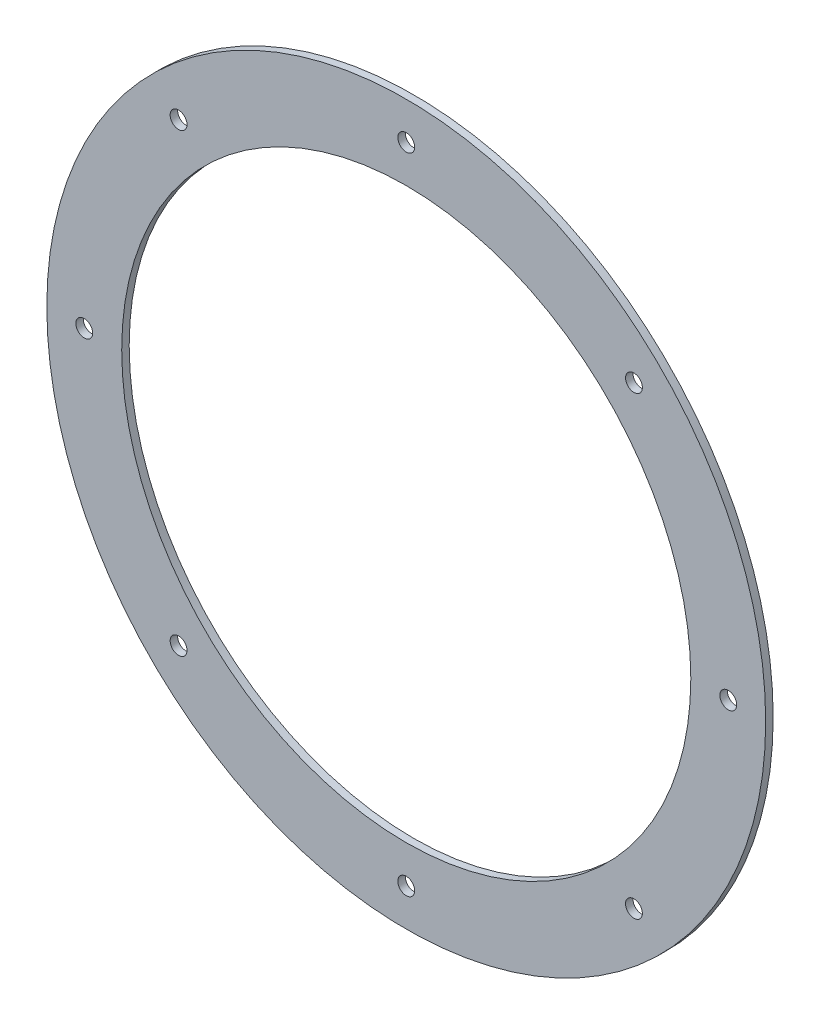
ISO-10303-21;
HEADER;
FILE_DESCRIPTION(('STEP AP214'),'2;1');
FILE_NAME('part.step','',(''),(''),'','','');
FILE_SCHEMA(('AUTOMOTIVE_DESIGN { 1 0 10303 214 1 1 1 1 }'));
ENDSEC;
DATA;
#1=APPLICATION_CONTEXT('core data for automotive mechanical design processes');
#2=APPLICATION_PROTOCOL_DEFINITION('international standard','automotive_design',2000,#1);
#3=PRODUCT_CONTEXT('',#1,'mechanical');
#4=PRODUCT('Part','Part','',(#3));
#5=PRODUCT_RELATED_PRODUCT_CATEGORY('part','',(#4));
#6=PRODUCT_DEFINITION_FORMATION('','',#4);
#7=PRODUCT_DEFINITION_CONTEXT('part definition',#1,'design');
#8=PRODUCT_DEFINITION('design','',#6,#7);
#9=PRODUCT_DEFINITION_SHAPE('','',#8);
#10=(LENGTH_UNIT() NAMED_UNIT(*) SI_UNIT(.MILLI.,.METRE.));
#11=(NAMED_UNIT(*) PLANE_ANGLE_UNIT() SI_UNIT($,.RADIAN.));
#12=(NAMED_UNIT(*) SI_UNIT($,.STERADIAN.) SOLID_ANGLE_UNIT());
#13=UNCERTAINTY_MEASURE_WITH_UNIT(LENGTH_MEASURE(1.E-05),#10,'distance_accuracy_value','');
#14=(GEOMETRIC_REPRESENTATION_CONTEXT(3) GLOBAL_UNCERTAINTY_ASSIGNED_CONTEXT((#13)) GLOBAL_UNIT_ASSIGNED_CONTEXT((#10,
#11,#12)) REPRESENTATION_CONTEXT('',''));
#15=CARTESIAN_POINT('',(0.,0.,0.));
#16=DIRECTION('',(0.,0.,1.));
#17=DIRECTION('',(1.,0.,0.));
#18=AXIS2_PLACEMENT_3D('',#15,#16,#17);
#19=CARTESIAN_POINT('',(0.,0.,-4.));
#20=DIRECTION('',(0.,0.,1.));
#21=DIRECTION('',(1.,0.,0.));
#22=AXIS2_PLACEMENT_3D('',#19,#20,#21);
#23=CYLINDRICAL_SURFACE('',#22,192.);
#24=CARTESIAN_POINT('',(0.,0.,-4.));
#25=DIRECTION('',(0.,0.,1.));
#26=DIRECTION('',(1.,0.,0.));
#27=AXIS2_PLACEMENT_3D('',#24,#25,#26);
#28=CIRCLE('',#27,192.);
#29=CARTESIAN_POINT('',(192.,0.,-4.));
#30=VERTEX_POINT('',#29);
#31=EDGE_CURVE('E10',#30,#30,#28,.T.);
#32=ORIENTED_EDGE('',*,*,#31,.T.);
#33=EDGE_LOOP('',(#32));
#34=FACE_BOUND('',#33,.T.);
#35=CARTESIAN_POINT('',(0.,0.,0.));
#36=DIRECTION('',(0.,0.,1.));
#37=DIRECTION('',(1.,0.,0.));
#38=AXIS2_PLACEMENT_3D('',#35,#36,#37);
#39=CIRCLE('',#38,192.);
#40=CARTESIAN_POINT('',(192.,0.,0.));
#41=VERTEX_POINT('',#40);
#42=EDGE_CURVE('E36',#41,#41,#39,.T.);
#43=ORIENTED_EDGE('',*,*,#42,.F.);
#44=EDGE_LOOP('',(#43));
#45=FACE_BOUND('',#44,.T.);
#46=ADVANCED_FACE('F33',(#34,#45),#23,.T.);
#47=CARTESIAN_POINT('',(0.,0.,-4.));
#48=DIRECTION('',(0.,0.,1.));
#49=DIRECTION('',(1.,0.,0.));
#50=AXIS2_PLACEMENT_3D('',#47,#48,#49);
#51=PLANE('',#50);
#52=CARTESIAN_POINT('',(121.622366364085,121.622366364088,-4.));
#53=DIRECTION('',(0.,0.,1.));
#54=DIRECTION('',(1.,0.,0.));
#55=AXIS2_PLACEMENT_3D('',#52,#53,#54);
#56=CIRCLE('',#55,4.5);
#57=CARTESIAN_POINT('',(126.122366364085,121.622366364088,-4.));
#58=VERTEX_POINT('',#57);
#59=EDGE_CURVE('E92',#58,#58,#56,.T.);
#60=ORIENTED_EDGE('',*,*,#59,.T.);
#61=EDGE_LOOP('',(#60));
#62=FACE_BOUND('',#61,.T.);
#63=CARTESIAN_POINT('',(172.,1.80160541433244E-12,-4.));
#64=DIRECTION('',(0.,0.,1.));
#65=DIRECTION('',(1.,0.,0.));
#66=AXIS2_PLACEMENT_3D('',#63,#64,#65);
#67=CIRCLE('',#66,4.5);
#68=CARTESIAN_POINT('',(176.5,1.80160541433244E-12,-4.));
#69=VERTEX_POINT('',#68);
#70=EDGE_CURVE('E86',#69,#69,#67,.T.);
#71=ORIENTED_EDGE('',*,*,#70,.T.);
#72=EDGE_LOOP('',(#71));
#73=FACE_BOUND('',#72,.T.);
#74=CARTESIAN_POINT('',(121.622366364087,-121.622366364085,-4.));
#75=DIRECTION('',(0.,0.,1.));
#76=DIRECTION('',(1.,0.,0.));
#77=AXIS2_PLACEMENT_3D('',#74,#75,#76);
#78=CIRCLE('',#77,4.5);
#79=CARTESIAN_POINT('',(126.122366364087,-121.622366364085,-4.));
#80=VERTEX_POINT('',#79);
#81=EDGE_CURVE('E80',#80,#80,#78,.T.);
#82=ORIENTED_EDGE('',*,*,#81,.T.);
#83=EDGE_LOOP('',(#82));
#84=FACE_BOUND('',#83,.T.);
#85=CARTESIAN_POINT('',(0.,-172.,-4.));
#86=DIRECTION('',(0.,0.,1.));
#87=DIRECTION('',(1.,0.,0.));
#88=AXIS2_PLACEMENT_3D('',#85,#86,#87);
#89=CIRCLE('',#88,4.5);
#90=CARTESIAN_POINT('',(4.5,-172.,-4.));
#91=VERTEX_POINT('',#90);
#92=EDGE_CURVE('E74',#91,#91,#89,.T.);
#93=ORIENTED_EDGE('',*,*,#92,.T.);
#94=EDGE_LOOP('',(#93));
#95=FACE_BOUND('',#94,.T.);
#96=CARTESIAN_POINT('',(-121.622366364086,-121.622366364087,-4.));
#97=DIRECTION('',(0.,0.,1.));
#98=DIRECTION('',(1.,0.,0.));
#99=AXIS2_PLACEMENT_3D('',#96,#97,#98);
#100=CIRCLE('',#99,4.5);
#101=CARTESIAN_POINT('',(-117.122366364086,-121.622366364087,-4.));
#102=VERTEX_POINT('',#101);
#103=EDGE_CURVE('E68',#102,#102,#100,.T.);
#104=ORIENTED_EDGE('',*,*,#103,.T.);
#105=EDGE_LOOP('',(#104));
#106=FACE_BOUND('',#105,.T.);
#107=CARTESIAN_POINT('',(-172.,-6.00535138110814E-13,-4.));
#108=DIRECTION('',(0.,0.,1.));
#109=DIRECTION('',(1.,0.,0.));
#110=AXIS2_PLACEMENT_3D('',#107,#108,#109);
#111=CIRCLE('',#110,4.5);
#112=CARTESIAN_POINT('',(-167.5,-6.00535138110814E-13,-4.));
#113=VERTEX_POINT('',#112);
#114=EDGE_CURVE('E62',#113,#113,#111,.T.);
#115=ORIENTED_EDGE('',*,*,#114,.T.);
#116=EDGE_LOOP('',(#115));
#117=FACE_BOUND('',#116,.T.);
#118=CARTESIAN_POINT('',(-121.622366364086,121.622366364086,-4.));
#119=DIRECTION('',(0.,0.,1.));
#120=DIRECTION('',(1.,0.,0.));
#121=AXIS2_PLACEMENT_3D('',#118,#119,#120);
#122=CIRCLE('',#121,4.5);
#123=CARTESIAN_POINT('',(-117.122366364086,121.622366364086,-4.));
#124=VERTEX_POINT('',#123);
#125=EDGE_CURVE('E56',#124,#124,#122,.T.);
#126=ORIENTED_EDGE('',*,*,#125,.T.);
#127=EDGE_LOOP('',(#126));
#128=FACE_BOUND('',#127,.T.);
#129=CARTESIAN_POINT('',(0.,172.,-4.));
#130=DIRECTION('',(0.,0.,1.));
#131=DIRECTION('',(1.,0.,0.));
#132=AXIS2_PLACEMENT_3D('',#129,#130,#131);
#133=CIRCLE('',#132,4.5);
#134=CARTESIAN_POINT('',(4.5,172.,-4.));
#135=VERTEX_POINT('',#134);
#136=EDGE_CURVE('E48',#135,#135,#133,.T.);
#137=ORIENTED_EDGE('',*,*,#136,.T.);
#138=EDGE_LOOP('',(#137));
#139=FACE_BOUND('',#138,.T.);
#140=CARTESIAN_POINT('',(0.,0.,-4.));
#141=DIRECTION('',(0.,0.,1.));
#142=DIRECTION('',(1.,0.,0.));
#143=AXIS2_PLACEMENT_3D('',#140,#141,#142);
#144=CIRCLE('',#143,152.);
#145=CARTESIAN_POINT('',(152.,0.,-4.));
#146=VERTEX_POINT('',#145);
#147=EDGE_CURVE('E43',#146,#146,#144,.T.);
#148=ORIENTED_EDGE('',*,*,#147,.T.);
#149=EDGE_LOOP('',(#148));
#150=FACE_BOUND('',#149,.T.);
#151=ORIENTED_EDGE('',*,*,#31,.F.);
#152=EDGE_LOOP('',(#151));
#153=FACE_BOUND('',#152,.T.);
#154=ADVANCED_FACE('F106',(#62,#73,#84,#95,#106,#117,#128,#139,#150,#153),#51,.F.);
#155=CARTESIAN_POINT('',(0.,0.,0.));
#156=DIRECTION('',(0.,0.,1.));
#157=DIRECTION('',(1.,0.,0.));
#158=AXIS2_PLACEMENT_3D('',#155,#156,#157);
#159=PLANE('',#158);
#160=CARTESIAN_POINT('',(121.622366364085,121.622366364088,0.));
#161=DIRECTION('',(0.,0.,1.));
#162=DIRECTION('',(0.707106781186556,-0.707106781186539,0.));
#163=AXIS2_PLACEMENT_3D('',#160,#161,#162);
#164=CIRCLE('',#163,4.5);
#165=CARTESIAN_POINT('',(124.804346879424,118.440385848748,0.));
#166=VERTEX_POINT('',#165);
#167=EDGE_CURVE('E95',#166,#166,#164,.T.);
#168=ORIENTED_EDGE('',*,*,#167,.F.);
#169=EDGE_LOOP('',(#168));
#170=FACE_BOUND('',#169,.T.);
#171=CARTESIAN_POINT('',(172.,1.80160541433244E-12,0.));
#172=DIRECTION('',(0.,0.,1.));
#173=DIRECTION('',(0.,-1.,0.));
#174=AXIS2_PLACEMENT_3D('',#171,#172,#173);
#175=CIRCLE('',#174,4.5);
#176=CARTESIAN_POINT('',(172.,-4.4999999999982,0.));
#177=VERTEX_POINT('',#176);
#178=EDGE_CURVE('E89',#177,#177,#175,.T.);
#179=ORIENTED_EDGE('',*,*,#178,.F.);
#180=EDGE_LOOP('',(#179));
#181=FACE_BOUND('',#180,.T.);
#182=CARTESIAN_POINT('',(121.622366364087,-121.622366364085,0.));
#183=DIRECTION('',(0.,0.,1.));
#184=DIRECTION('',(-0.707106781186541,-0.707106781186554,0.));
#185=AXIS2_PLACEMENT_3D('',#182,#183,#184);
#186=CIRCLE('',#185,4.5);
#187=CARTESIAN_POINT('',(118.440385848748,-124.804346879425,0.));
#188=VERTEX_POINT('',#187);
#189=EDGE_CURVE('E83',#188,#188,#186,.T.);
#190=ORIENTED_EDGE('',*,*,#189,.F.);
#191=EDGE_LOOP('',(#190));
#192=FACE_BOUND('',#191,.T.);
#193=CARTESIAN_POINT('',(0.,-172.,0.));
#194=DIRECTION('',(0.,0.,1.));
#195=DIRECTION('',(-1.,0.,0.));
#196=AXIS2_PLACEMENT_3D('',#193,#194,#195);
#197=CIRCLE('',#196,4.5);
#198=CARTESIAN_POINT('',(-4.5,-172.,0.));
#199=VERTEX_POINT('',#198);
#200=EDGE_CURVE('E77',#199,#199,#197,.T.);
#201=ORIENTED_EDGE('',*,*,#200,.F.);
#202=EDGE_LOOP('',(#201));
#203=FACE_BOUND('',#202,.T.);
#204=CARTESIAN_POINT('',(-121.622366364086,-121.622366364087,0.));
#205=DIRECTION('',(0.,0.,1.));
#206=DIRECTION('',(-0.707106781186551,0.707106781186544,0.));
#207=AXIS2_PLACEMENT_3D('',#204,#205,#206);
#208=CIRCLE('',#207,4.5);
#209=CARTESIAN_POINT('',(-124.804346879425,-118.440385848747,0.));
#210=VERTEX_POINT('',#209);
#211=EDGE_CURVE('E71',#210,#210,#208,.T.);
#212=ORIENTED_EDGE('',*,*,#211,.F.);
#213=EDGE_LOOP('',(#212));
#214=FACE_BOUND('',#213,.T.);
#215=CARTESIAN_POINT('',(-172.,-6.00535138110814E-13,0.));
#216=DIRECTION('',(0.,0.,1.));
#217=DIRECTION('',(0.,1.,0.));
#218=AXIS2_PLACEMENT_3D('',#215,#216,#217);
#219=CIRCLE('',#218,4.5);
#220=CARTESIAN_POINT('',(-172.,4.4999999999994,0.));
#221=VERTEX_POINT('',#220);
#222=EDGE_CURVE('E65',#221,#221,#219,.T.);
#223=ORIENTED_EDGE('',*,*,#222,.F.);
#224=EDGE_LOOP('',(#223));
#225=FACE_BOUND('',#224,.T.);
#226=CARTESIAN_POINT('',(-121.622366364086,121.622366364086,0.));
#227=DIRECTION('',(0.,0.,1.));
#228=DIRECTION('',(0.707106781186546,0.707106781186549,0.));
#229=AXIS2_PLACEMENT_3D('',#226,#227,#228);
#230=CIRCLE('',#229,4.5);
#231=CARTESIAN_POINT('',(-118.440385848747,124.804346879425,0.));
#232=VERTEX_POINT('',#231);
#233=EDGE_CURVE('E59',#232,#232,#230,.T.);
#234=ORIENTED_EDGE('',*,*,#233,.F.);
#235=EDGE_LOOP('',(#234));
#236=FACE_BOUND('',#235,.T.);
#237=CARTESIAN_POINT('',(0.,172.,0.));
#238=DIRECTION('',(0.,0.,1.));
#239=DIRECTION('',(1.,0.,0.));
#240=AXIS2_PLACEMENT_3D('',#237,#238,#239);
#241=CIRCLE('',#240,4.5);
#242=CARTESIAN_POINT('',(4.5,172.,0.));
#243=VERTEX_POINT('',#242);
#244=EDGE_CURVE('E53',#243,#243,#241,.T.);
#245=ORIENTED_EDGE('',*,*,#244,.F.);
#246=EDGE_LOOP('',(#245));
#247=FACE_BOUND('',#246,.T.);
#248=CARTESIAN_POINT('',(0.,0.,0.));
#249=DIRECTION('',(0.,0.,1.));
#250=DIRECTION('',(1.,0.,0.));
#251=AXIS2_PLACEMENT_3D('',#248,#249,#250);
#252=CIRCLE('',#251,152.);
#253=CARTESIAN_POINT('',(152.,0.,0.));
#254=VERTEX_POINT('',#253);
#255=EDGE_CURVE('E45',#254,#254,#252,.T.);
#256=ORIENTED_EDGE('',*,*,#255,.F.);
#257=EDGE_LOOP('',(#256));
#258=FACE_BOUND('',#257,.T.);
#259=ORIENTED_EDGE('',*,*,#42,.T.);
#260=EDGE_LOOP('',(#259));
#261=FACE_BOUND('',#260,.T.);
#262=ADVANCED_FACE('F102',(#170,#181,#192,#203,#214,#225,#236,#247,#258,#261),#159,.T.);
#263=CARTESIAN_POINT('',(0.,0.,-4.));
#264=DIRECTION('',(0.,0.,1.));
#265=DIRECTION('',(1.,0.,0.));
#266=AXIS2_PLACEMENT_3D('',#263,#264,#265);
#267=CYLINDRICAL_SURFACE('',#266,152.);
#268=ORIENTED_EDGE('',*,*,#147,.F.);
#269=EDGE_LOOP('',(#268));
#270=FACE_BOUND('',#269,.T.);
#271=ORIENTED_EDGE('',*,*,#255,.T.);
#272=EDGE_LOOP('',(#271));
#273=FACE_BOUND('',#272,.T.);
#274=ADVANCED_FACE('F105',(#270,#273),#267,.F.);
#275=CARTESIAN_POINT('',(0.,172.,-10.));
#276=DIRECTION('',(0.,0.,1.));
#277=DIRECTION('',(1.,0.,0.));
#278=AXIS2_PLACEMENT_3D('',#275,#276,#277);
#279=CYLINDRICAL_SURFACE('',#278,4.5);
#280=ORIENTED_EDGE('',*,*,#244,.T.);
#281=EDGE_LOOP('',(#280));
#282=FACE_BOUND('',#281,.T.);
#283=ORIENTED_EDGE('',*,*,#136,.F.);
#284=EDGE_LOOP('',(#283));
#285=FACE_BOUND('',#284,.T.);
#286=ADVANCED_FACE('F138',(#282,#285),#279,.F.);
#287=CARTESIAN_POINT('',(-121.622366364086,121.622366364086,-10.));
#288=DIRECTION('',(0.,0.,1.));
#289=DIRECTION('',(1.,0.,0.));
#290=AXIS2_PLACEMENT_3D('',#287,#288,#289);
#291=CYLINDRICAL_SURFACE('',#290,4.5);
#292=ORIENTED_EDGE('',*,*,#233,.T.);
#293=EDGE_LOOP('',(#292));
#294=FACE_BOUND('',#293,.T.);
#295=ORIENTED_EDGE('',*,*,#125,.F.);
#296=EDGE_LOOP('',(#295));
#297=FACE_BOUND('',#296,.T.);
#298=ADVANCED_FACE('F142',(#294,#297),#291,.F.);
#299=CARTESIAN_POINT('',(-172.,-6.00535138110814E-13,-10.));
#300=DIRECTION('',(0.,0.,1.));
#301=DIRECTION('',(1.,0.,0.));
#302=AXIS2_PLACEMENT_3D('',#299,#300,#301);
#303=CYLINDRICAL_SURFACE('',#302,4.5);
#304=ORIENTED_EDGE('',*,*,#222,.T.);
#305=EDGE_LOOP('',(#304));
#306=FACE_BOUND('',#305,.T.);
#307=ORIENTED_EDGE('',*,*,#114,.F.);
#308=EDGE_LOOP('',(#307));
#309=FACE_BOUND('',#308,.T.);
#310=ADVANCED_FACE('F146',(#306,#309),#303,.F.);
#311=CARTESIAN_POINT('',(-121.622366364086,-121.622366364087,-10.));
#312=DIRECTION('',(0.,0.,1.));
#313=DIRECTION('',(1.,0.,0.));
#314=AXIS2_PLACEMENT_3D('',#311,#312,#313);
#315=CYLINDRICAL_SURFACE('',#314,4.5);
#316=ORIENTED_EDGE('',*,*,#211,.T.);
#317=EDGE_LOOP('',(#316));
#318=FACE_BOUND('',#317,.T.);
#319=ORIENTED_EDGE('',*,*,#103,.F.);
#320=EDGE_LOOP('',(#319));
#321=FACE_BOUND('',#320,.T.);
#322=ADVANCED_FACE('F150',(#318,#321),#315,.F.);
#323=CARTESIAN_POINT('',(0.,-172.,-10.));
#324=DIRECTION('',(0.,0.,1.));
#325=DIRECTION('',(1.,0.,0.));
#326=AXIS2_PLACEMENT_3D('',#323,#324,#325);
#327=CYLINDRICAL_SURFACE('',#326,4.5);
#328=ORIENTED_EDGE('',*,*,#200,.T.);
#329=EDGE_LOOP('',(#328));
#330=FACE_BOUND('',#329,.T.);
#331=ORIENTED_EDGE('',*,*,#92,.F.);
#332=EDGE_LOOP('',(#331));
#333=FACE_BOUND('',#332,.T.);
#334=ADVANCED_FACE('F154',(#330,#333),#327,.F.);
#335=CARTESIAN_POINT('',(121.622366364087,-121.622366364085,-10.));
#336=DIRECTION('',(0.,0.,1.));
#337=DIRECTION('',(1.,0.,0.));
#338=AXIS2_PLACEMENT_3D('',#335,#336,#337);
#339=CYLINDRICAL_SURFACE('',#338,4.5);
#340=ORIENTED_EDGE('',*,*,#189,.T.);
#341=EDGE_LOOP('',(#340));
#342=FACE_BOUND('',#341,.T.);
#343=ORIENTED_EDGE('',*,*,#81,.F.);
#344=EDGE_LOOP('',(#343));
#345=FACE_BOUND('',#344,.T.);
#346=ADVANCED_FACE('F158',(#342,#345),#339,.F.);
#347=CARTESIAN_POINT('',(172.,1.80160541433244E-12,-10.));
#348=DIRECTION('',(0.,0.,1.));
#349=DIRECTION('',(1.,0.,0.));
#350=AXIS2_PLACEMENT_3D('',#347,#348,#349);
#351=CYLINDRICAL_SURFACE('',#350,4.5);
#352=ORIENTED_EDGE('',*,*,#178,.T.);
#353=EDGE_LOOP('',(#352));
#354=FACE_BOUND('',#353,.T.);
#355=ORIENTED_EDGE('',*,*,#70,.F.);
#356=EDGE_LOOP('',(#355));
#357=FACE_BOUND('',#356,.T.);
#358=ADVANCED_FACE('F162',(#354,#357),#351,.F.);
#359=CARTESIAN_POINT('',(121.622366364085,121.622366364088,-10.));
#360=DIRECTION('',(0.,0.,1.));
#361=DIRECTION('',(1.,0.,0.));
#362=AXIS2_PLACEMENT_3D('',#359,#360,#361);
#363=CYLINDRICAL_SURFACE('',#362,4.5);
#364=ORIENTED_EDGE('',*,*,#167,.T.);
#365=EDGE_LOOP('',(#364));
#366=FACE_BOUND('',#365,.T.);
#367=ORIENTED_EDGE('',*,*,#59,.F.);
#368=EDGE_LOOP('',(#367));
#369=FACE_BOUND('',#368,.T.);
#370=ADVANCED_FACE('F99',(#366,#369),#363,.F.);
#371=CLOSED_SHELL('',(#46,#154,#262,#274,#286,#298,#310,#322,#334,#346,#358,#370));
#372=MANIFOLD_SOLID_BREP('B2',#371);
#373=ADVANCED_BREP_SHAPE_REPRESENTATION('',(#18,#372),#14);
#374=SHAPE_DEFINITION_REPRESENTATION(#9,#373);
ENDSEC;
END-ISO-10303-21;
